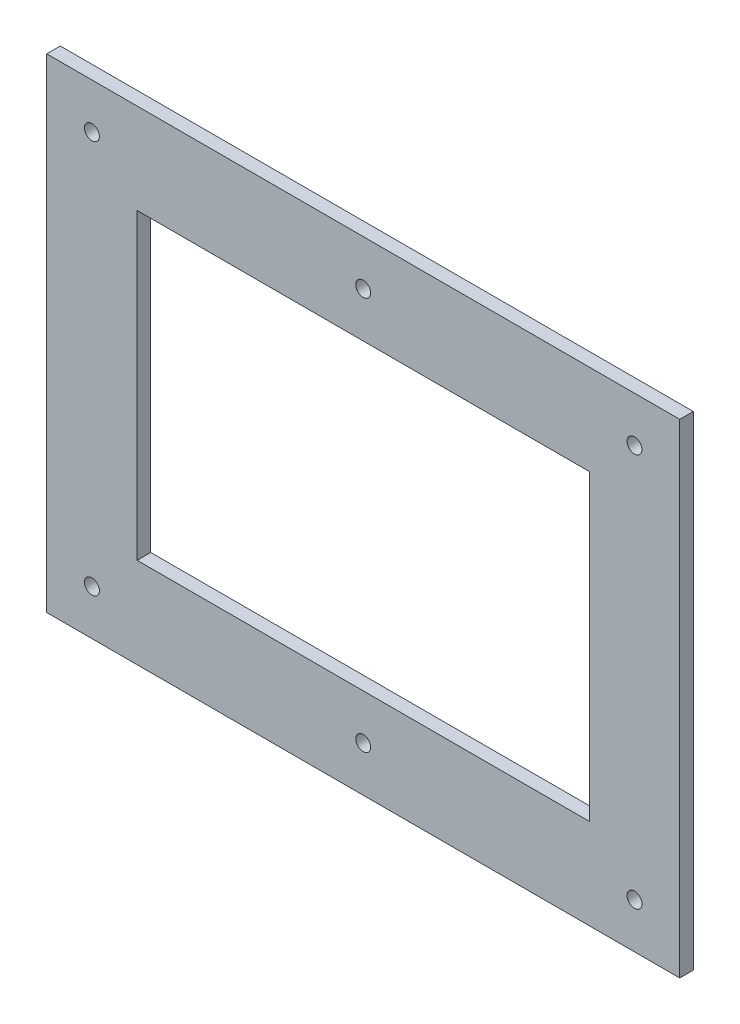
ISO-10303-21;
HEADER;
FILE_DESCRIPTION(('STEP AP214'),'2;1');
FILE_NAME('part.step','',(''),(''),'','','');
FILE_SCHEMA(('AUTOMOTIVE_DESIGN { 1 0 10303 214 1 1 1 1 }'));
ENDSEC;
DATA;
#1=APPLICATION_CONTEXT('core data for automotive mechanical design processes');
#2=APPLICATION_PROTOCOL_DEFINITION('international standard','automotive_design',2000,#1);
#3=PRODUCT_CONTEXT('',#1,'mechanical');
#4=PRODUCT('Part','Part','',(#3));
#5=PRODUCT_RELATED_PRODUCT_CATEGORY('part','',(#4));
#6=PRODUCT_DEFINITION_FORMATION('','',#4);
#7=PRODUCT_DEFINITION_CONTEXT('part definition',#1,'design');
#8=PRODUCT_DEFINITION('design','',#6,#7);
#9=PRODUCT_DEFINITION_SHAPE('','',#8);
#10=(LENGTH_UNIT() NAMED_UNIT(*) SI_UNIT(.MILLI.,.METRE.));
#11=(NAMED_UNIT(*) PLANE_ANGLE_UNIT() SI_UNIT($,.RADIAN.));
#12=(NAMED_UNIT(*) SI_UNIT($,.STERADIAN.) SOLID_ANGLE_UNIT());
#13=UNCERTAINTY_MEASURE_WITH_UNIT(LENGTH_MEASURE(1.E-05),#10,'distance_accuracy_value','');
#14=(GEOMETRIC_REPRESENTATION_CONTEXT(3) GLOBAL_UNCERTAINTY_ASSIGNED_CONTEXT((#13)) GLOBAL_UNIT_ASSIGNED_CONTEXT((#10,
#11,#12)) REPRESENTATION_CONTEXT('',''));
#15=CARTESIAN_POINT('',(0.,0.,0.));
#16=DIRECTION('',(0.,0.,1.));
#17=DIRECTION('',(1.,0.,0.));
#18=AXIS2_PLACEMENT_3D('',#15,#16,#17);
#19=CARTESIAN_POINT('',(0.,0.,3.));
#20=DIRECTION('',(0.,0.,1.));
#21=DIRECTION('',(1.,0.,0.));
#22=AXIS2_PLACEMENT_3D('',#19,#20,#21);
#23=PLANE('',#22);
#24=CARTESIAN_POINT('',(50.,77.,3.));
#25=DIRECTION('',(0.,0.,1.));
#26=DIRECTION('',(1.,0.,0.));
#27=AXIS2_PLACEMENT_3D('',#24,#25,#26);
#28=CIRCLE('',#27,1.65);
#29=CARTESIAN_POINT('',(51.65,77.,3.));
#30=VERTEX_POINT('',#29);
#31=EDGE_CURVE('E253',#30,#30,#28,.T.);
#32=ORIENTED_EDGE('',*,*,#31,.F.);
#33=EDGE_LOOP('',(#32));
#34=FACE_BOUND('',#33,.T.);
#35=CARTESIAN_POINT('',(-9.99999999999999,-10.,3.));
#36=DIRECTION('',(0.,0.,1.));
#37=DIRECTION('',(1.,0.,0.));
#38=AXIS2_PLACEMENT_3D('',#35,#36,#37);
#39=CIRCLE('',#38,1.65);
#40=CARTESIAN_POINT('',(-8.34999999999999,-10.,3.));
#41=VERTEX_POINT('',#40);
#42=EDGE_CURVE('E265',#41,#41,#39,.T.);
#43=ORIENTED_EDGE('',*,*,#42,.F.);
#44=EDGE_LOOP('',(#43));
#45=FACE_BOUND('',#44,.T.);
#46=CARTESIAN_POINT('',(110.,77.,3.));
#47=DIRECTION('',(0.,0.,1.));
#48=DIRECTION('',(1.,0.,0.));
#49=AXIS2_PLACEMENT_3D('',#46,#47,#48);
#50=CIRCLE('',#49,1.65);
#51=CARTESIAN_POINT('',(111.65,77.,3.));
#52=VERTEX_POINT('',#51);
#53=EDGE_CURVE('E127',#52,#52,#50,.T.);
#54=ORIENTED_EDGE('',*,*,#53,.F.);
#55=EDGE_LOOP('',(#54));
#56=FACE_BOUND('',#55,.T.);
#57=DIRECTION('',(0.,-1.,0.));
#58=VECTOR('',#57,1.);
#59=CARTESIAN_POINT('',(-20.,87.,3.));
#60=LINE('',#59,#58);
#61=CARTESIAN_POINT('',(-20.,87.,3.));
#62=VERTEX_POINT('',#61);
#63=CARTESIAN_POINT('',(-20.,-20.,3.));
#64=VERTEX_POINT('',#63);
#65=EDGE_CURVE('E137',#62,#64,#60,.T.);
#66=ORIENTED_EDGE('',*,*,#65,.T.);
#67=DIRECTION('',(1.,0.,0.));
#68=VECTOR('',#67,1.);
#69=CARTESIAN_POINT('',(-20.,-20.,3.));
#70=LINE('',#69,#68);
#71=CARTESIAN_POINT('',(120.,-20.,3.));
#72=VERTEX_POINT('',#71);
#73=EDGE_CURVE('E140',#64,#72,#70,.T.);
#74=ORIENTED_EDGE('',*,*,#73,.T.);
#75=DIRECTION('',(0.,1.,0.));
#76=VECTOR('',#75,1.);
#77=CARTESIAN_POINT('',(120.,87.,3.));
#78=LINE('',#77,#76);
#79=CARTESIAN_POINT('',(120.,87.,3.));
#80=VERTEX_POINT('',#79);
#81=EDGE_CURVE('E143',#72,#80,#78,.T.);
#82=ORIENTED_EDGE('',*,*,#81,.T.);
#83=DIRECTION('',(-1.,0.,0.));
#84=VECTOR('',#83,1.);
#85=CARTESIAN_POINT('',(-20.,87.,3.));
#86=LINE('',#85,#84);
#87=EDGE_CURVE('E145',#80,#62,#86,.T.);
#88=ORIENTED_EDGE('',*,*,#87,.T.);
#89=EDGE_LOOP('',(#66,#74,#82,#88));
#90=FACE_BOUND('',#89,.T.);
#91=DIRECTION('',(1.,0.,0.));
#92=VECTOR('',#91,1.);
#93=CARTESIAN_POINT('',(0.,0.,3.));
#94=LINE('',#93,#92);
#95=CARTESIAN_POINT('',(0.,0.,3.));
#96=VERTEX_POINT('',#95);
#97=CARTESIAN_POINT('',(100.,0.,3.));
#98=VERTEX_POINT('',#97);
#99=EDGE_CURVE('E106',#96,#98,#94,.T.);
#100=ORIENTED_EDGE('',*,*,#99,.F.);
#101=DIRECTION('',(0.,-1.,0.));
#102=VECTOR('',#101,1.);
#103=CARTESIAN_POINT('',(0.,0.,3.));
#104=LINE('',#103,#102);
#105=CARTESIAN_POINT('',(0.,67.,3.));
#106=VERTEX_POINT('',#105);
#107=EDGE_CURVE('E98',#106,#96,#104,.T.);
#108=ORIENTED_EDGE('',*,*,#107,.F.);
#109=DIRECTION('',(-1.,0.,0.));
#110=VECTOR('',#109,1.);
#111=CARTESIAN_POINT('',(0.,67.,3.));
#112=LINE('',#111,#110);
#113=CARTESIAN_POINT('',(100.,67.,3.));
#114=VERTEX_POINT('',#113);
#115=EDGE_CURVE('E121',#114,#106,#112,.T.);
#116=ORIENTED_EDGE('',*,*,#115,.F.);
#117=DIRECTION('',(0.,1.,0.));
#118=VECTOR('',#117,1.);
#119=CARTESIAN_POINT('',(100.,0.,3.));
#120=LINE('',#119,#118);
#121=EDGE_CURVE('E119',#98,#114,#120,.T.);
#122=ORIENTED_EDGE('',*,*,#121,.F.);
#123=EDGE_LOOP('',(#100,#108,#116,#122));
#124=FACE_BOUND('',#123,.T.);
#125=CARTESIAN_POINT('',(-10.,77.,3.));
#126=DIRECTION('',(0.,0.,1.));
#127=DIRECTION('',(1.,0.,0.));
#128=AXIS2_PLACEMENT_3D('',#125,#126,#127);
#129=CIRCLE('',#128,1.65);
#130=CARTESIAN_POINT('',(-8.35,77.,3.));
#131=VERTEX_POINT('',#130);
#132=EDGE_CURVE('E271',#131,#131,#129,.T.);
#133=ORIENTED_EDGE('',*,*,#132,.F.);
#134=EDGE_LOOP('',(#133));
#135=FACE_BOUND('',#134,.T.);
#136=CARTESIAN_POINT('',(110.,-9.99999999999999,3.));
#137=DIRECTION('',(0.,0.,1.));
#138=DIRECTION('',(1.,0.,0.));
#139=AXIS2_PLACEMENT_3D('',#136,#137,#138);
#140=CIRCLE('',#139,1.65);
#141=CARTESIAN_POINT('',(111.65,-9.99999999999999,3.));
#142=VERTEX_POINT('',#141);
#143=EDGE_CURVE('E259',#142,#142,#140,.T.);
#144=ORIENTED_EDGE('',*,*,#143,.F.);
#145=EDGE_LOOP('',(#144));
#146=FACE_BOUND('',#145,.T.);
#147=CARTESIAN_POINT('',(50.,-9.99999999999999,3.));
#148=DIRECTION('',(0.,0.,1.));
#149=DIRECTION('',(1.,0.,0.));
#150=AXIS2_PLACEMENT_3D('',#147,#148,#149);
#151=CIRCLE('',#150,1.65);
#152=CARTESIAN_POINT('',(51.65,-9.99999999999999,3.));
#153=VERTEX_POINT('',#152);
#154=EDGE_CURVE('E244',#153,#153,#151,.T.);
#155=ORIENTED_EDGE('',*,*,#154,.F.);
#156=EDGE_LOOP('',(#155));
#157=FACE_BOUND('',#156,.T.);
#158=ADVANCED_FACE('F33',(#34,#45,#56,#90,#124,#135,#146,#157),#23,.T.);
#159=CARTESIAN_POINT('',(0.,0.,0.));
#160=DIRECTION('',(0.,0.,1.));
#161=DIRECTION('',(1.,0.,0.));
#162=AXIS2_PLACEMENT_3D('',#159,#160,#161);
#163=PLANE('',#162);
#164=DIRECTION('',(0.,-1.,0.));
#165=VECTOR('',#164,1.);
#166=CARTESIAN_POINT('',(-20.,87.,0.));
#167=LINE('',#166,#165);
#168=CARTESIAN_POINT('',(-20.,87.,0.));
#169=VERTEX_POINT('',#168);
#170=CARTESIAN_POINT('',(-20.,-20.,0.));
#171=VERTEX_POINT('',#170);
#172=EDGE_CURVE('E114',#169,#171,#167,.T.);
#173=ORIENTED_EDGE('',*,*,#172,.F.);
#174=DIRECTION('',(-1.,0.,0.));
#175=VECTOR('',#174,1.);
#176=CARTESIAN_POINT('',(-20.,87.,0.));
#177=LINE('',#176,#175);
#178=CARTESIAN_POINT('',(120.,87.,0.));
#179=VERTEX_POINT('',#178);
#180=EDGE_CURVE('E141',#179,#169,#177,.T.);
#181=ORIENTED_EDGE('',*,*,#180,.F.);
#182=DIRECTION('',(0.,1.,0.));
#183=VECTOR('',#182,1.);
#184=CARTESIAN_POINT('',(120.,87.,0.));
#185=LINE('',#184,#183);
#186=CARTESIAN_POINT('',(120.,-20.,0.));
#187=VERTEX_POINT('',#186);
#188=EDGE_CURVE('E152',#187,#179,#185,.T.);
#189=ORIENTED_EDGE('',*,*,#188,.F.);
#190=DIRECTION('',(1.,0.,0.));
#191=VECTOR('',#190,1.);
#192=CARTESIAN_POINT('',(-20.,-20.,0.));
#193=LINE('',#192,#191);
#194=EDGE_CURVE('E150',#171,#187,#193,.T.);
#195=ORIENTED_EDGE('',*,*,#194,.F.);
#196=EDGE_LOOP('',(#173,#181,#189,#195));
#197=FACE_BOUND('',#196,.T.);
#198=DIRECTION('',(0.,-1.,0.));
#199=VECTOR('',#198,1.);
#200=CARTESIAN_POINT('',(0.,0.,0.));
#201=LINE('',#200,#199);
#202=CARTESIAN_POINT('',(0.,67.,0.));
#203=VERTEX_POINT('',#202);
#204=CARTESIAN_POINT('',(0.,0.,0.));
#205=VERTEX_POINT('',#204);
#206=EDGE_CURVE('E56',#203,#205,#201,.T.);
#207=ORIENTED_EDGE('',*,*,#206,.T.);
#208=DIRECTION('',(1.,0.,0.));
#209=VECTOR('',#208,1.);
#210=CARTESIAN_POINT('',(0.,0.,0.));
#211=LINE('',#210,#209);
#212=CARTESIAN_POINT('',(100.,0.,0.));
#213=VERTEX_POINT('',#212);
#214=EDGE_CURVE('E113',#205,#213,#211,.T.);
#215=ORIENTED_EDGE('',*,*,#214,.T.);
#216=DIRECTION('',(0.,1.,0.));
#217=VECTOR('',#216,1.);
#218=CARTESIAN_POINT('',(100.,0.,0.));
#219=LINE('',#218,#217);
#220=CARTESIAN_POINT('',(100.,67.,0.));
#221=VERTEX_POINT('',#220);
#222=EDGE_CURVE('E129',#213,#221,#219,.T.);
#223=ORIENTED_EDGE('',*,*,#222,.T.);
#224=DIRECTION('',(-1.,0.,0.));
#225=VECTOR('',#224,1.);
#226=CARTESIAN_POINT('',(0.,67.,0.));
#227=LINE('',#226,#225);
#228=EDGE_CURVE('E107',#221,#203,#227,.T.);
#229=ORIENTED_EDGE('',*,*,#228,.T.);
#230=EDGE_LOOP('',(#207,#215,#223,#229));
#231=FACE_BOUND('',#230,.T.);
#232=CARTESIAN_POINT('',(110.,77.,0.));
#233=DIRECTION('',(0.,0.,1.));
#234=DIRECTION('',(1.,0.,0.));
#235=AXIS2_PLACEMENT_3D('',#232,#233,#234);
#236=CIRCLE('',#235,1.65);
#237=CARTESIAN_POINT('',(111.65,77.,0.));
#238=VERTEX_POINT('',#237);
#239=EDGE_CURVE('E274',#238,#238,#236,.T.);
#240=ORIENTED_EDGE('',*,*,#239,.T.);
#241=EDGE_LOOP('',(#240));
#242=FACE_BOUND('',#241,.T.);
#243=CARTESIAN_POINT('',(-10.,77.,0.));
#244=DIRECTION('',(0.,0.,1.));
#245=DIRECTION('',(1.,0.,0.));
#246=AXIS2_PLACEMENT_3D('',#243,#244,#245);
#247=CIRCLE('',#246,1.65);
#248=CARTESIAN_POINT('',(-8.35,77.,0.));
#249=VERTEX_POINT('',#248);
#250=EDGE_CURVE('E268',#249,#249,#247,.T.);
#251=ORIENTED_EDGE('',*,*,#250,.T.);
#252=EDGE_LOOP('',(#251));
#253=FACE_BOUND('',#252,.T.);
#254=CARTESIAN_POINT('',(-9.99999999999999,-10.,0.));
#255=DIRECTION('',(0.,0.,1.));
#256=DIRECTION('',(1.,0.,0.));
#257=AXIS2_PLACEMENT_3D('',#254,#255,#256);
#258=CIRCLE('',#257,1.65);
#259=CARTESIAN_POINT('',(-8.34999999999999,-10.,0.));
#260=VERTEX_POINT('',#259);
#261=EDGE_CURVE('E262',#260,#260,#258,.T.);
#262=ORIENTED_EDGE('',*,*,#261,.T.);
#263=EDGE_LOOP('',(#262));
#264=FACE_BOUND('',#263,.T.);
#265=CARTESIAN_POINT('',(110.,-9.99999999999999,0.));
#266=DIRECTION('',(0.,0.,1.));
#267=DIRECTION('',(1.,0.,0.));
#268=AXIS2_PLACEMENT_3D('',#265,#266,#267);
#269=CIRCLE('',#268,1.65);
#270=CARTESIAN_POINT('',(111.65,-9.99999999999999,0.));
#271=VERTEX_POINT('',#270);
#272=EDGE_CURVE('E256',#271,#271,#269,.T.);
#273=ORIENTED_EDGE('',*,*,#272,.T.);
#274=EDGE_LOOP('',(#273));
#275=FACE_BOUND('',#274,.T.);
#276=CARTESIAN_POINT('',(50.,77.,0.));
#277=DIRECTION('',(0.,0.,1.));
#278=DIRECTION('',(1.,0.,0.));
#279=AXIS2_PLACEMENT_3D('',#276,#277,#278);
#280=CIRCLE('',#279,1.65);
#281=CARTESIAN_POINT('',(51.65,77.,0.));
#282=VERTEX_POINT('',#281);
#283=EDGE_CURVE('E250',#282,#282,#280,.T.);
#284=ORIENTED_EDGE('',*,*,#283,.T.);
#285=EDGE_LOOP('',(#284));
#286=FACE_BOUND('',#285,.T.);
#287=CARTESIAN_POINT('',(50.,-9.99999999999999,0.));
#288=DIRECTION('',(0.,0.,1.));
#289=DIRECTION('',(1.,0.,0.));
#290=AXIS2_PLACEMENT_3D('',#287,#288,#289);
#291=CIRCLE('',#290,1.65);
#292=CARTESIAN_POINT('',(51.65,-9.99999999999999,0.));
#293=VERTEX_POINT('',#292);
#294=EDGE_CURVE('E247',#293,#293,#291,.T.);
#295=ORIENTED_EDGE('',*,*,#294,.T.);
#296=EDGE_LOOP('',(#295));
#297=FACE_BOUND('',#296,.T.);
#298=ADVANCED_FACE('F170',(#197,#231,#242,#253,#264,#275,#286,#297),#163,.F.);
#299=CARTESIAN_POINT('',(-20.,87.,3.));
#300=DIRECTION('',(1.,0.,0.));
#301=DIRECTION('',(0.,1.,0.));
#302=AXIS2_PLACEMENT_3D('',#299,#300,#301);
#303=PLANE('',#302);
#304=ORIENTED_EDGE('',*,*,#172,.T.);
#305=DIRECTION('',(0.,0.,-1.));
#306=VECTOR('',#305,1.);
#307=CARTESIAN_POINT('',(-20.,-20.,3.));
#308=LINE('',#307,#306);
#309=EDGE_CURVE('E11',#64,#171,#308,.T.);
#310=ORIENTED_EDGE('',*,*,#309,.F.);
#311=ORIENTED_EDGE('',*,*,#65,.F.);
#312=DIRECTION('',(0.,0.,-1.));
#313=VECTOR('',#312,1.);
#314=CARTESIAN_POINT('',(-20.,87.,3.));
#315=LINE('',#314,#313);
#316=EDGE_CURVE('E147',#62,#169,#315,.T.);
#317=ORIENTED_EDGE('',*,*,#316,.T.);
#318=EDGE_LOOP('',(#304,#310,#311,#317));
#319=FACE_BOUND('',#318,.T.);
#320=ADVANCED_FACE('F35',(#319),#303,.F.);
#321=CARTESIAN_POINT('',(-20.,-20.,3.));
#322=DIRECTION('',(0.,1.,0.));
#323=DIRECTION('',(-1.,0.,0.));
#324=AXIS2_PLACEMENT_3D('',#321,#322,#323);
#325=PLANE('',#324);
#326=ORIENTED_EDGE('',*,*,#194,.T.);
#327=DIRECTION('',(0.,0.,-1.));
#328=VECTOR('',#327,1.);
#329=CARTESIAN_POINT('',(120.,-20.,3.));
#330=LINE('',#329,#328);
#331=EDGE_CURVE('E41',#72,#187,#330,.T.);
#332=ORIENTED_EDGE('',*,*,#331,.F.);
#333=ORIENTED_EDGE('',*,*,#73,.F.);
#334=ORIENTED_EDGE('',*,*,#309,.T.);
#335=EDGE_LOOP('',(#326,#332,#333,#334));
#336=FACE_BOUND('',#335,.T.);
#337=ADVANCED_FACE('F180',(#336),#325,.F.);
#338=CARTESIAN_POINT('',(120.,87.,3.));
#339=DIRECTION('',(-1.,0.,0.));
#340=DIRECTION('',(0.,-1.,0.));
#341=AXIS2_PLACEMENT_3D('',#338,#339,#340);
#342=PLANE('',#341);
#343=ORIENTED_EDGE('',*,*,#188,.T.);
#344=DIRECTION('',(0.,0.,-1.));
#345=VECTOR('',#344,1.);
#346=CARTESIAN_POINT('',(120.,87.,3.));
#347=LINE('',#346,#345);
#348=EDGE_CURVE('E157',#80,#179,#347,.T.);
#349=ORIENTED_EDGE('',*,*,#348,.F.);
#350=ORIENTED_EDGE('',*,*,#81,.F.);
#351=ORIENTED_EDGE('',*,*,#331,.T.);
#352=EDGE_LOOP('',(#343,#349,#350,#351));
#353=FACE_BOUND('',#352,.T.);
#354=ADVANCED_FACE('F164',(#353),#342,.F.);
#355=CARTESIAN_POINT('',(-20.,87.,3.));
#356=DIRECTION('',(0.,-1.,0.));
#357=DIRECTION('',(1.,0.,0.));
#358=AXIS2_PLACEMENT_3D('',#355,#356,#357);
#359=PLANE('',#358);
#360=ORIENTED_EDGE('',*,*,#180,.T.);
#361=ORIENTED_EDGE('',*,*,#316,.F.);
#362=ORIENTED_EDGE('',*,*,#87,.F.);
#363=ORIENTED_EDGE('',*,*,#348,.T.);
#364=EDGE_LOOP('',(#360,#361,#362,#363));
#365=FACE_BOUND('',#364,.T.);
#366=ADVANCED_FACE('F174',(#365),#359,.F.);
#367=CARTESIAN_POINT('',(0.,0.,3.));
#368=DIRECTION('',(1.,0.,0.));
#369=DIRECTION('',(0.,0.,-1.));
#370=AXIS2_PLACEMENT_3D('',#367,#368,#369);
#371=PLANE('',#370);
#372=ORIENTED_EDGE('',*,*,#206,.F.);
#373=DIRECTION('',(0.,0.,-1.));
#374=VECTOR('',#373,1.);
#375=CARTESIAN_POINT('',(0.,67.,3.));
#376=LINE('',#375,#374);
#377=EDGE_CURVE('E102',#106,#203,#376,.T.);
#378=ORIENTED_EDGE('',*,*,#377,.F.);
#379=ORIENTED_EDGE('',*,*,#107,.T.);
#380=DIRECTION('',(0.,0.,-1.));
#381=VECTOR('',#380,1.);
#382=CARTESIAN_POINT('',(0.,0.,3.));
#383=LINE('',#382,#381);
#384=EDGE_CURVE('E101',#96,#205,#383,.T.);
#385=ORIENTED_EDGE('',*,*,#384,.T.);
#386=EDGE_LOOP('',(#372,#378,#379,#385));
#387=FACE_BOUND('',#386,.T.);
#388=ADVANCED_FACE('F100',(#387),#371,.T.);
#389=CARTESIAN_POINT('',(0.,0.,3.));
#390=DIRECTION('',(0.,1.,0.));
#391=DIRECTION('',(0.,0.,1.));
#392=AXIS2_PLACEMENT_3D('',#389,#390,#391);
#393=PLANE('',#392);
#394=ORIENTED_EDGE('',*,*,#214,.F.);
#395=ORIENTED_EDGE('',*,*,#384,.F.);
#396=ORIENTED_EDGE('',*,*,#99,.T.);
#397=DIRECTION('',(0.,0.,-1.));
#398=VECTOR('',#397,1.);
#399=CARTESIAN_POINT('',(100.,0.,3.));
#400=LINE('',#399,#398);
#401=EDGE_CURVE('E115',#98,#213,#400,.T.);
#402=ORIENTED_EDGE('',*,*,#401,.T.);
#403=EDGE_LOOP('',(#394,#395,#396,#402));
#404=FACE_BOUND('',#403,.T.);
#405=ADVANCED_FACE('F110',(#404),#393,.T.);
#406=CARTESIAN_POINT('',(100.,0.,3.));
#407=DIRECTION('',(-1.,0.,0.));
#408=DIRECTION('',(0.,0.,1.));
#409=AXIS2_PLACEMENT_3D('',#406,#407,#408);
#410=PLANE('',#409);
#411=ORIENTED_EDGE('',*,*,#222,.F.);
#412=ORIENTED_EDGE('',*,*,#401,.F.);
#413=ORIENTED_EDGE('',*,*,#121,.T.);
#414=DIRECTION('',(0.,0.,-1.));
#415=VECTOR('',#414,1.);
#416=CARTESIAN_POINT('',(100.,67.,3.));
#417=LINE('',#416,#415);
#418=EDGE_CURVE('E48',#114,#221,#417,.T.);
#419=ORIENTED_EDGE('',*,*,#418,.T.);
#420=EDGE_LOOP('',(#411,#412,#413,#419));
#421=FACE_BOUND('',#420,.T.);
#422=ADVANCED_FACE('F206',(#421),#410,.T.);
#423=CARTESIAN_POINT('',(0.,67.,3.));
#424=DIRECTION('',(0.,-1.,0.));
#425=DIRECTION('',(0.,0.,-1.));
#426=AXIS2_PLACEMENT_3D('',#423,#424,#425);
#427=PLANE('',#426);
#428=ORIENTED_EDGE('',*,*,#228,.F.);
#429=ORIENTED_EDGE('',*,*,#418,.F.);
#430=ORIENTED_EDGE('',*,*,#115,.T.);
#431=ORIENTED_EDGE('',*,*,#377,.T.);
#432=EDGE_LOOP('',(#428,#429,#430,#431));
#433=FACE_BOUND('',#432,.T.);
#434=ADVANCED_FACE('F210',(#433),#427,.T.);
#435=CARTESIAN_POINT('',(110.,77.,3.));
#436=DIRECTION('',(0.,0.,-1.));
#437=DIRECTION('',(-1.,0.,0.));
#438=AXIS2_PLACEMENT_3D('',#435,#436,#437);
#439=CYLINDRICAL_SURFACE('',#438,1.65);
#440=ORIENTED_EDGE('',*,*,#53,.T.);
#441=EDGE_LOOP('',(#440));
#442=FACE_BOUND('',#441,.T.);
#443=ORIENTED_EDGE('',*,*,#239,.F.);
#444=EDGE_LOOP('',(#443));
#445=FACE_BOUND('',#444,.T.);
#446=ADVANCED_FACE('F216',(#442,#445),#439,.F.);
#447=CARTESIAN_POINT('',(-10.,77.,3.));
#448=DIRECTION('',(0.,0.,-1.));
#449=DIRECTION('',(-1.,0.,0.));
#450=AXIS2_PLACEMENT_3D('',#447,#448,#449);
#451=CYLINDRICAL_SURFACE('',#450,1.65);
#452=ORIENTED_EDGE('',*,*,#132,.T.);
#453=EDGE_LOOP('',(#452));
#454=FACE_BOUND('',#453,.T.);
#455=ORIENTED_EDGE('',*,*,#250,.F.);
#456=EDGE_LOOP('',(#455));
#457=FACE_BOUND('',#456,.T.);
#458=ADVANCED_FACE('F219',(#454,#457),#451,.F.);
#459=CARTESIAN_POINT('',(-9.99999999999999,-10.,3.));
#460=DIRECTION('',(0.,0.,-1.));
#461=DIRECTION('',(-1.,0.,0.));
#462=AXIS2_PLACEMENT_3D('',#459,#460,#461);
#463=CYLINDRICAL_SURFACE('',#462,1.65);
#464=ORIENTED_EDGE('',*,*,#42,.T.);
#465=EDGE_LOOP('',(#464));
#466=FACE_BOUND('',#465,.T.);
#467=ORIENTED_EDGE('',*,*,#261,.F.);
#468=EDGE_LOOP('',(#467));
#469=FACE_BOUND('',#468,.T.);
#470=ADVANCED_FACE('F223',(#466,#469),#463,.F.);
#471=CARTESIAN_POINT('',(110.,-9.99999999999999,3.));
#472=DIRECTION('',(0.,0.,-1.));
#473=DIRECTION('',(-1.,0.,0.));
#474=AXIS2_PLACEMENT_3D('',#471,#472,#473);
#475=CYLINDRICAL_SURFACE('',#474,1.65);
#476=ORIENTED_EDGE('',*,*,#143,.T.);
#477=EDGE_LOOP('',(#476));
#478=FACE_BOUND('',#477,.T.);
#479=ORIENTED_EDGE('',*,*,#272,.F.);
#480=EDGE_LOOP('',(#479));
#481=FACE_BOUND('',#480,.T.);
#482=ADVANCED_FACE('F227',(#478,#481),#475,.F.);
#483=CARTESIAN_POINT('',(50.,77.,3.));
#484=DIRECTION('',(0.,0.,-1.));
#485=DIRECTION('',(-1.,0.,0.));
#486=AXIS2_PLACEMENT_3D('',#483,#484,#485);
#487=CYLINDRICAL_SURFACE('',#486,1.65);
#488=ORIENTED_EDGE('',*,*,#31,.T.);
#489=EDGE_LOOP('',(#488));
#490=FACE_BOUND('',#489,.T.);
#491=ORIENTED_EDGE('',*,*,#283,.F.);
#492=EDGE_LOOP('',(#491));
#493=FACE_BOUND('',#492,.T.);
#494=ADVANCED_FACE('F231',(#490,#493),#487,.F.);
#495=CARTESIAN_POINT('',(50.,-9.99999999999999,3.));
#496=DIRECTION('',(0.,0.,-1.));
#497=DIRECTION('',(-1.,0.,0.));
#498=AXIS2_PLACEMENT_3D('',#495,#496,#497);
#499=CYLINDRICAL_SURFACE('',#498,1.65);
#500=ORIENTED_EDGE('',*,*,#154,.T.);
#501=EDGE_LOOP('',(#500));
#502=FACE_BOUND('',#501,.T.);
#503=ORIENTED_EDGE('',*,*,#294,.F.);
#504=EDGE_LOOP('',(#503));
#505=FACE_BOUND('',#504,.T.);
#506=ADVANCED_FACE('F235',(#502,#505),#499,.F.);
#507=CLOSED_SHELL('',(#158,#298,#320,#337,#354,#366,#388,#405,#422,#434,#446,#458,#470,#482,
#494,#506));
#508=MANIFOLD_SOLID_BREP('B2',#507);
#509=ADVANCED_BREP_SHAPE_REPRESENTATION('',(#18,#508),#14);
#510=SHAPE_DEFINITION_REPRESENTATION(#9,#509);
ENDSEC;
END-ISO-10303-21;
